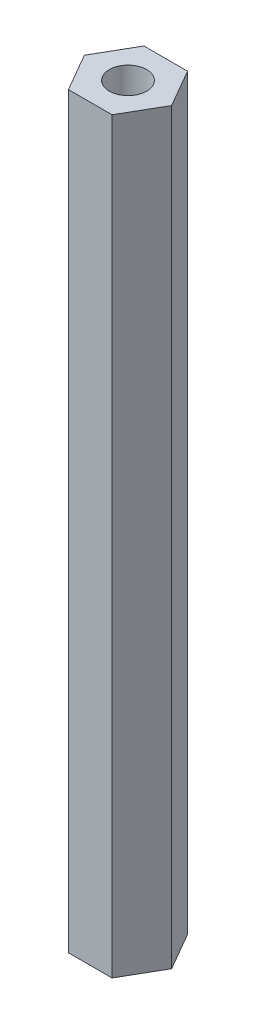
ISO-10303-21;
HEADER;
FILE_DESCRIPTION(('STEP AP214'),'2;1');
FILE_NAME('part.step','',(''),(''),'','','');
FILE_SCHEMA(('AUTOMOTIVE_DESIGN { 1 0 10303 214 1 1 1 1 }'));
ENDSEC;
DATA;
#1=APPLICATION_CONTEXT('core data for automotive mechanical design processes');
#2=APPLICATION_PROTOCOL_DEFINITION('international standard','automotive_design',2000,#1);
#3=PRODUCT_CONTEXT('',#1,'mechanical');
#4=PRODUCT('Part','Part','',(#3));
#5=PRODUCT_RELATED_PRODUCT_CATEGORY('part','',(#4));
#6=PRODUCT_DEFINITION_FORMATION('','',#4);
#7=PRODUCT_DEFINITION_CONTEXT('part definition',#1,'design');
#8=PRODUCT_DEFINITION('design','',#6,#7);
#9=PRODUCT_DEFINITION_SHAPE('','',#8);
#10=(LENGTH_UNIT() NAMED_UNIT(*) SI_UNIT(.MILLI.,.METRE.));
#11=(NAMED_UNIT(*) PLANE_ANGLE_UNIT() SI_UNIT($,.RADIAN.));
#12=(NAMED_UNIT(*) SI_UNIT($,.STERADIAN.) SOLID_ANGLE_UNIT());
#13=UNCERTAINTY_MEASURE_WITH_UNIT(LENGTH_MEASURE(1.E-05),#10,'distance_accuracy_value','');
#14=(GEOMETRIC_REPRESENTATION_CONTEXT(3) GLOBAL_UNCERTAINTY_ASSIGNED_CONTEXT((#13)) GLOBAL_UNIT_ASSIGNED_CONTEXT((#10,
#11,#12)) REPRESENTATION_CONTEXT('',''));
#15=CARTESIAN_POINT('',(0.,0.,0.));
#16=DIRECTION('',(0.,0.,1.));
#17=DIRECTION('',(1.,0.,0.));
#18=AXIS2_PLACEMENT_3D('',#15,#16,#17);
#19=CARTESIAN_POINT('',(0.,60.,0.));
#20=DIRECTION('',(0.,1.,0.));
#21=DIRECTION('',(0.,0.,1.));
#22=AXIS2_PLACEMENT_3D('',#19,#20,#21);
#23=PLANE('',#22);
#24=DIRECTION('',(-0.499999999999995,0.,0.866025403784441));
#25=VECTOR('',#24,1.);
#26=CARTESIAN_POINT('',(-1.74933927747139,60.,-3.02994450825619));
#27=LINE('',#26,#25);
#28=CARTESIAN_POINT('',(-1.74933927747139,60.,-3.02994450825619));
#29=VERTEX_POINT('',#28);
#30=CARTESIAN_POINT('',(-3.49867855494271,60.,0.));
#31=VERTEX_POINT('',#30);
#32=EDGE_CURVE('E134',#29,#31,#27,.T.);
#33=ORIENTED_EDGE('',*,*,#32,.T.);
#34=DIRECTION('',(0.500000000000001,0.,0.866025403784438));
#35=VECTOR('',#34,1.);
#36=CARTESIAN_POINT('',(-3.49867855494271,60.,0.));
#37=LINE('',#36,#35);
#38=CARTESIAN_POINT('',(-1.74933927747135,60.,3.02994450825622));
#39=VERTEX_POINT('',#38);
#40=EDGE_CURVE('E92',#31,#39,#37,.T.);
#41=ORIENTED_EDGE('',*,*,#40,.T.);
#42=DIRECTION('',(1.,0.,0.));
#43=VECTOR('',#42,1.);
#44=CARTESIAN_POINT('',(-1.74933927747135,60.,3.02994450825622));
#45=LINE('',#44,#43);
#46=CARTESIAN_POINT('',(1.74933927747137,60.,3.02994450825621));
#47=VERTEX_POINT('',#46);
#48=EDGE_CURVE('E105',#39,#47,#45,.T.);
#49=ORIENTED_EDGE('',*,*,#48,.T.);
#50=DIRECTION('',(0.499999999999995,0.,-0.866025403784442));
#51=VECTOR('',#50,1.);
#52=CARTESIAN_POINT('',(1.74933927747137,60.,3.02994450825621));
#53=LINE('',#52,#51);
#54=CARTESIAN_POINT('',(3.49867855494271,60.,0.));
#55=VERTEX_POINT('',#54);
#56=EDGE_CURVE('E99',#47,#55,#53,.T.);
#57=ORIENTED_EDGE('',*,*,#56,.T.);
#58=DIRECTION('',(-0.500000000000007,0.,-0.866025403784435));
#59=VECTOR('',#58,1.);
#60=CARTESIAN_POINT('',(3.49867855494271,60.,0.));
#61=LINE('',#60,#59);
#62=CARTESIAN_POINT('',(1.74933927747133,60.,-3.02994450825623));
#63=VERTEX_POINT('',#62);
#64=EDGE_CURVE('E103',#55,#63,#61,.T.);
#65=ORIENTED_EDGE('',*,*,#64,.T.);
#66=DIRECTION('',(-1.,0.,0.));
#67=VECTOR('',#66,1.);
#68=CARTESIAN_POINT('',(1.74933927747133,60.,-3.02994450825623));
#69=LINE('',#68,#67);
#70=EDGE_CURVE('E55',#63,#29,#69,.T.);
#71=ORIENTED_EDGE('',*,*,#70,.T.);
#72=EDGE_LOOP('',(#33,#41,#49,#57,#65,#71));
#73=FACE_BOUND('',#72,.T.);
#74=CARTESIAN_POINT('',(0.,60.,0.));
#75=DIRECTION('',(0.,1.,0.));
#76=DIRECTION('',(0.,0.,1.));
#77=AXIS2_PLACEMENT_3D('',#74,#75,#76);
#78=CIRCLE('',#77,1.5);
#79=CARTESIAN_POINT('',(0.,60.,1.5));
#80=VERTEX_POINT('',#79);
#81=EDGE_CURVE('E127',#80,#80,#78,.T.);
#82=ORIENTED_EDGE('',*,*,#81,.F.);
#83=EDGE_LOOP('',(#82));
#84=FACE_BOUND('',#83,.T.);
#85=ADVANCED_FACE('F38',(#73,#84),#23,.T.);
#86=CARTESIAN_POINT('',(0.,0.,0.));
#87=DIRECTION('',(0.,1.,0.));
#88=DIRECTION('',(0.,0.,1.));
#89=AXIS2_PLACEMENT_3D('',#86,#87,#88);
#90=PLANE('',#89);
#91=DIRECTION('',(-0.499999999999995,0.,0.866025403784441));
#92=VECTOR('',#91,1.);
#93=CARTESIAN_POINT('',(-1.74933927747139,0.,-3.02994450825619));
#94=LINE('',#93,#92);
#95=CARTESIAN_POINT('',(-1.74933927747139,0.,-3.02994450825619));
#96=VERTEX_POINT('',#95);
#97=CARTESIAN_POINT('',(-3.49867855494271,0.,0.));
#98=VERTEX_POINT('',#97);
#99=EDGE_CURVE('E123',#96,#98,#94,.T.);
#100=ORIENTED_EDGE('',*,*,#99,.F.);
#101=DIRECTION('',(-1.,0.,0.));
#102=VECTOR('',#101,1.);
#103=CARTESIAN_POINT('',(1.74933927747133,0.,-3.02994450825623));
#104=LINE('',#103,#102);
#105=CARTESIAN_POINT('',(1.74933927747133,0.,-3.02994450825623));
#106=VERTEX_POINT('',#105);
#107=EDGE_CURVE('E84',#106,#96,#104,.T.);
#108=ORIENTED_EDGE('',*,*,#107,.F.);
#109=DIRECTION('',(-0.500000000000007,0.,-0.866025403784435));
#110=VECTOR('',#109,1.);
#111=CARTESIAN_POINT('',(3.49867855494271,0.,0.));
#112=LINE('',#111,#110);
#113=CARTESIAN_POINT('',(3.49867855494271,0.,0.));
#114=VERTEX_POINT('',#113);
#115=EDGE_CURVE('E78',#114,#106,#112,.T.);
#116=ORIENTED_EDGE('',*,*,#115,.F.);
#117=DIRECTION('',(0.499999999999995,0.,-0.866025403784442));
#118=VECTOR('',#117,1.);
#119=CARTESIAN_POINT('',(1.74933927747137,0.,3.02994450825621));
#120=LINE('',#119,#118);
#121=CARTESIAN_POINT('',(1.74933927747137,0.,3.02994450825621));
#122=VERTEX_POINT('',#121);
#123=EDGE_CURVE('E113',#122,#114,#120,.T.);
#124=ORIENTED_EDGE('',*,*,#123,.F.);
#125=DIRECTION('',(1.,0.,0.));
#126=VECTOR('',#125,1.);
#127=CARTESIAN_POINT('',(-1.74933927747135,0.,3.02994450825622));
#128=LINE('',#127,#126);
#129=CARTESIAN_POINT('',(-1.74933927747135,0.,3.02994450825622));
#130=VERTEX_POINT('',#129);
#131=EDGE_CURVE('E129',#130,#122,#128,.T.);
#132=ORIENTED_EDGE('',*,*,#131,.F.);
#133=DIRECTION('',(0.500000000000001,0.,0.866025403784438));
#134=VECTOR('',#133,1.);
#135=CARTESIAN_POINT('',(-3.49867855494271,0.,0.));
#136=LINE('',#135,#134);
#137=EDGE_CURVE('E126',#98,#130,#136,.T.);
#138=ORIENTED_EDGE('',*,*,#137,.F.);
#139=EDGE_LOOP('',(#100,#108,#116,#124,#132,#138));
#140=FACE_BOUND('',#139,.T.);
#141=CARTESIAN_POINT('',(0.,0.,0.));
#142=DIRECTION('',(0.,1.,0.));
#143=DIRECTION('',(0.,0.,1.));
#144=AXIS2_PLACEMENT_3D('',#141,#142,#143);
#145=CIRCLE('',#144,1.5);
#146=CARTESIAN_POINT('',(0.,0.,1.5));
#147=VERTEX_POINT('',#146);
#148=EDGE_CURVE('E227',#147,#147,#145,.T.);
#149=ORIENTED_EDGE('',*,*,#148,.T.);
#150=EDGE_LOOP('',(#149));
#151=FACE_BOUND('',#150,.T.);
#152=ADVANCED_FACE('F143',(#140,#151),#90,.F.);
#153=CARTESIAN_POINT('',(-1.74933927747139,60.,-3.02994450825619));
#154=DIRECTION('',(0.866025403784441,0.,0.499999999999995));
#155=DIRECTION('',(0.499999999999995,0.,-0.866025403784442));
#156=AXIS2_PLACEMENT_3D('',#153,#154,#155);
#157=PLANE('',#156);
#158=ORIENTED_EDGE('',*,*,#99,.T.);
#159=DIRECTION('',(0.,-1.,0.));
#160=VECTOR('',#159,1.);
#161=CARTESIAN_POINT('',(-3.49867855494271,60.,0.));
#162=LINE('',#161,#160);
#163=EDGE_CURVE('E11',#31,#98,#162,.T.);
#164=ORIENTED_EDGE('',*,*,#163,.F.);
#165=ORIENTED_EDGE('',*,*,#32,.F.);
#166=DIRECTION('',(0.,-1.,0.));
#167=VECTOR('',#166,1.);
#168=CARTESIAN_POINT('',(-1.74933927747139,60.,-3.02994450825619));
#169=LINE('',#168,#167);
#170=EDGE_CURVE('E119',#29,#96,#169,.T.);
#171=ORIENTED_EDGE('',*,*,#170,.T.);
#172=EDGE_LOOP('',(#158,#164,#165,#171));
#173=FACE_BOUND('',#172,.T.);
#174=ADVANCED_FACE('F40',(#173),#157,.F.);
#175=CARTESIAN_POINT('',(-3.49867855494271,60.,0.));
#176=DIRECTION('',(0.866025403784438,0.,-0.500000000000001));
#177=DIRECTION('',(-0.500000000000001,0.,-0.866025403784438));
#178=AXIS2_PLACEMENT_3D('',#175,#176,#177);
#179=PLANE('',#178);
#180=ORIENTED_EDGE('',*,*,#137,.T.);
#181=DIRECTION('',(0.,-1.,0.));
#182=VECTOR('',#181,1.);
#183=CARTESIAN_POINT('',(-1.74933927747135,60.,3.02994450825622));
#184=LINE('',#183,#182);
#185=EDGE_CURVE('E47',#39,#130,#184,.T.);
#186=ORIENTED_EDGE('',*,*,#185,.F.);
#187=ORIENTED_EDGE('',*,*,#40,.F.);
#188=ORIENTED_EDGE('',*,*,#163,.T.);
#189=EDGE_LOOP('',(#180,#186,#187,#188));
#190=FACE_BOUND('',#189,.T.);
#191=ADVANCED_FACE('F168',(#190),#179,.F.);
#192=CARTESIAN_POINT('',(-1.74933927747135,60.,3.02994450825622));
#193=DIRECTION('',(0.,0.,-1.));
#194=DIRECTION('',(-1.,0.,0.));
#195=AXIS2_PLACEMENT_3D('',#192,#193,#194);
#196=PLANE('',#195);
#197=ORIENTED_EDGE('',*,*,#131,.T.);
#198=DIRECTION('',(0.,-1.,0.));
#199=VECTOR('',#198,1.);
#200=CARTESIAN_POINT('',(1.74933927747137,60.,3.02994450825621));
#201=LINE('',#200,#199);
#202=EDGE_CURVE('E114',#47,#122,#201,.T.);
#203=ORIENTED_EDGE('',*,*,#202,.F.);
#204=ORIENTED_EDGE('',*,*,#48,.F.);
#205=ORIENTED_EDGE('',*,*,#185,.T.);
#206=EDGE_LOOP('',(#197,#203,#204,#205));
#207=FACE_BOUND('',#206,.T.);
#208=ADVANCED_FACE('F140',(#207),#196,.F.);
#209=CARTESIAN_POINT('',(1.74933927747137,60.,3.02994450825621));
#210=DIRECTION('',(-0.866025403784441,0.,-0.499999999999995));
#211=DIRECTION('',(-0.499999999999995,0.,0.866025403784442));
#212=AXIS2_PLACEMENT_3D('',#209,#210,#211);
#213=PLANE('',#212);
#214=ORIENTED_EDGE('',*,*,#123,.T.);
#215=DIRECTION('',(0.,-1.,0.));
#216=VECTOR('',#215,1.);
#217=CARTESIAN_POINT('',(3.49867855494271,60.,0.));
#218=LINE('',#217,#216);
#219=EDGE_CURVE('E110',#55,#114,#218,.T.);
#220=ORIENTED_EDGE('',*,*,#219,.F.);
#221=ORIENTED_EDGE('',*,*,#56,.F.);
#222=ORIENTED_EDGE('',*,*,#202,.T.);
#223=EDGE_LOOP('',(#214,#220,#221,#222));
#224=FACE_BOUND('',#223,.T.);
#225=ADVANCED_FACE('F111',(#224),#213,.F.);
#226=CARTESIAN_POINT('',(3.49867855494271,60.,0.));
#227=DIRECTION('',(-0.866025403784435,0.,0.500000000000007));
#228=DIRECTION('',(0.500000000000007,0.,0.866025403784435));
#229=AXIS2_PLACEMENT_3D('',#226,#227,#228);
#230=PLANE('',#229);
#231=ORIENTED_EDGE('',*,*,#115,.T.);
#232=DIRECTION('',(0.,-1.,0.));
#233=VECTOR('',#232,1.);
#234=CARTESIAN_POINT('',(1.74933927747133,60.,-3.02994450825623));
#235=LINE('',#234,#233);
#236=EDGE_CURVE('E115',#63,#106,#235,.T.);
#237=ORIENTED_EDGE('',*,*,#236,.F.);
#238=ORIENTED_EDGE('',*,*,#64,.F.);
#239=ORIENTED_EDGE('',*,*,#219,.T.);
#240=EDGE_LOOP('',(#231,#237,#238,#239));
#241=FACE_BOUND('',#240,.T.);
#242=ADVANCED_FACE('F117',(#241),#230,.F.);
#243=CARTESIAN_POINT('',(1.74933927747133,60.,-3.02994450825623));
#244=DIRECTION('',(0.,0.,1.));
#245=DIRECTION('',(1.,0.,0.));
#246=AXIS2_PLACEMENT_3D('',#243,#244,#245);
#247=PLANE('',#246);
#248=ORIENTED_EDGE('',*,*,#107,.T.);
#249=ORIENTED_EDGE('',*,*,#170,.F.);
#250=ORIENTED_EDGE('',*,*,#70,.F.);
#251=ORIENTED_EDGE('',*,*,#236,.T.);
#252=EDGE_LOOP('',(#248,#249,#250,#251));
#253=FACE_BOUND('',#252,.T.);
#254=ADVANCED_FACE('F148',(#253),#247,.F.);
#255=CARTESIAN_POINT('',(0.,60.,0.));
#256=DIRECTION('',(0.,-1.,0.));
#257=DIRECTION('',(0.,0.,-1.));
#258=AXIS2_PLACEMENT_3D('',#255,#256,#257);
#259=CYLINDRICAL_SURFACE('',#258,1.5);
#260=ORIENTED_EDGE('',*,*,#81,.T.);
#261=EDGE_LOOP('',(#260));
#262=FACE_BOUND('',#261,.T.);
#263=ORIENTED_EDGE('',*,*,#148,.F.);
#264=EDGE_LOOP('',(#263));
#265=FACE_BOUND('',#264,.T.);
#266=ADVANCED_FACE('F150',(#262,#265),#259,.F.);
#267=CLOSED_SHELL('',(#85,#152,#174,#191,#208,#225,#242,#254,#266));
#268=MANIFOLD_SOLID_BREP('B2',#267);
#269=ADVANCED_BREP_SHAPE_REPRESENTATION('',(#18,#268),#14);
#270=SHAPE_DEFINITION_REPRESENTATION(#9,#269);
ENDSEC;
END-ISO-10303-21;
